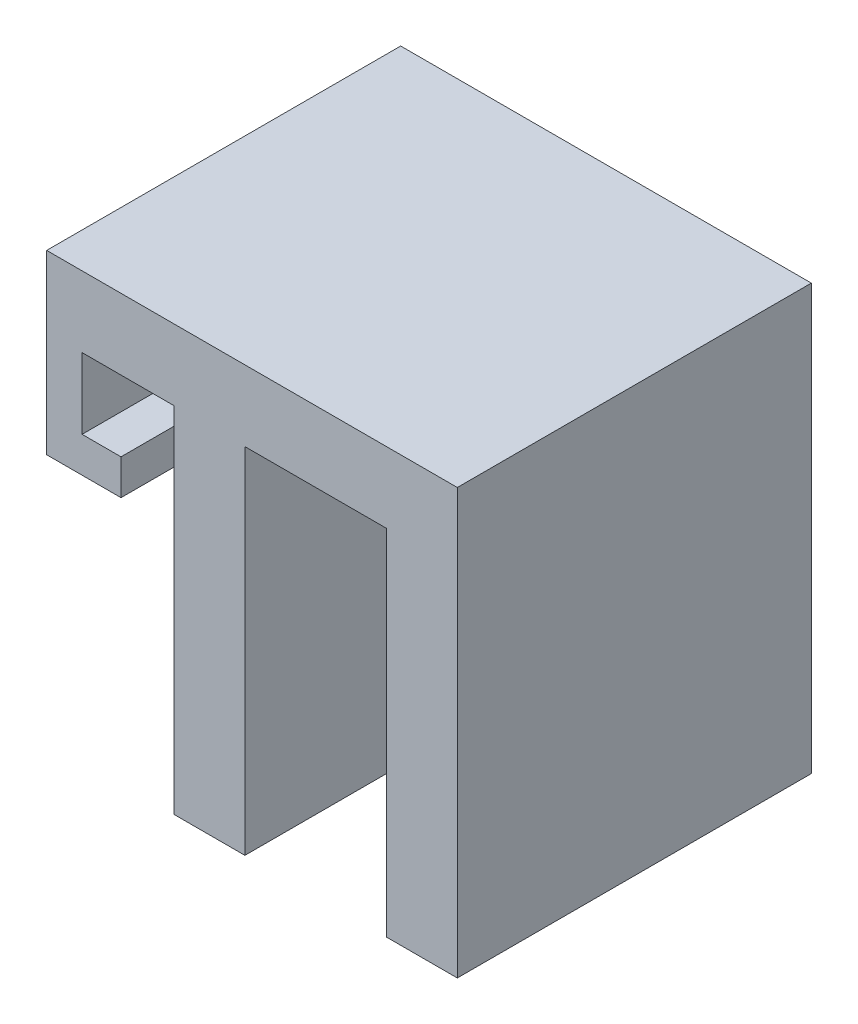
ISO-10303-21;
HEADER;
FILE_DESCRIPTION(('STEP AP214'),'2;1');
FILE_NAME('part.step','',(''),(''),'','','');
FILE_SCHEMA(('AUTOMOTIVE_DESIGN { 1 0 10303 214 1 1 1 1 }'));
ENDSEC;
DATA;
#1=APPLICATION_CONTEXT('core data for automotive mechanical design processes');
#2=APPLICATION_PROTOCOL_DEFINITION('international standard','automotive_design',2000,#1);
#3=PRODUCT_CONTEXT('',#1,'mechanical');
#4=PRODUCT('Part','Part','',(#3));
#5=PRODUCT_RELATED_PRODUCT_CATEGORY('part','',(#4));
#6=PRODUCT_DEFINITION_FORMATION('','',#4);
#7=PRODUCT_DEFINITION_CONTEXT('part definition',#1,'design');
#8=PRODUCT_DEFINITION('design','',#6,#7);
#9=PRODUCT_DEFINITION_SHAPE('','',#8);
#10=(LENGTH_UNIT() NAMED_UNIT(*) SI_UNIT(.MILLI.,.METRE.));
#11=(NAMED_UNIT(*) PLANE_ANGLE_UNIT() SI_UNIT($,.RADIAN.));
#12=(NAMED_UNIT(*) SI_UNIT($,.STERADIAN.) SOLID_ANGLE_UNIT());
#13=UNCERTAINTY_MEASURE_WITH_UNIT(LENGTH_MEASURE(1.E-05),#10,'distance_accuracy_value','');
#14=(GEOMETRIC_REPRESENTATION_CONTEXT(3) GLOBAL_UNCERTAINTY_ASSIGNED_CONTEXT((#13)) GLOBAL_UNIT_ASSIGNED_CONTEXT((#10,
#11,#12)) REPRESENTATION_CONTEXT('',''));
#15=CARTESIAN_POINT('',(0.,0.,0.));
#16=DIRECTION('',(0.,0.,1.));
#17=DIRECTION('',(1.,0.,0.));
#18=AXIS2_PLACEMENT_3D('',#15,#16,#17);
#19=CARTESIAN_POINT('',(0.,0.,10.));
#20=DIRECTION('',(1.,0.,0.));
#21=DIRECTION('',(0.,1.,0.));
#22=AXIS2_PLACEMENT_3D('',#19,#20,#21);
#23=PLANE('',#22);
#24=DIRECTION('',(0.,-1.,0.));
#25=VECTOR('',#24,1.);
#26=CARTESIAN_POINT('',(0.,0.,0.));
#27=LINE('',#26,#25);
#28=CARTESIAN_POINT('',(0.,0.,0.));
#29=VERTEX_POINT('',#28);
#30=CARTESIAN_POINT('',(0.,-10.,0.));
#31=VERTEX_POINT('',#30);
#32=EDGE_CURVE('E165',#29,#31,#27,.T.);
#33=ORIENTED_EDGE('',*,*,#32,.T.);
#34=DIRECTION('',(0.,0.,-1.));
#35=VECTOR('',#34,1.);
#36=CARTESIAN_POINT('',(0.,-10.,10.));
#37=LINE('',#36,#35);
#38=CARTESIAN_POINT('',(0.,-10.,10.));
#39=VERTEX_POINT('',#38);
#40=EDGE_CURVE('E11',#39,#31,#37,.T.);
#41=ORIENTED_EDGE('',*,*,#40,.F.);
#42=DIRECTION('',(0.,-1.,0.));
#43=VECTOR('',#42,1.);
#44=CARTESIAN_POINT('',(0.,0.,10.));
#45=LINE('',#44,#43);
#46=CARTESIAN_POINT('',(0.,0.,10.));
#47=VERTEX_POINT('',#46);
#48=EDGE_CURVE('E193',#47,#39,#45,.T.);
#49=ORIENTED_EDGE('',*,*,#48,.F.);
#50=DIRECTION('',(0.,0.,-1.));
#51=VECTOR('',#50,1.);
#52=CARTESIAN_POINT('',(0.,0.,10.));
#53=LINE('',#52,#51);
#54=EDGE_CURVE('E161',#47,#29,#53,.T.);
#55=ORIENTED_EDGE('',*,*,#54,.T.);
#56=EDGE_LOOP('',(#33,#41,#49,#55));
#57=FACE_BOUND('',#56,.T.);
#58=ADVANCED_FACE('F33',(#57),#23,.F.);
#59=CARTESIAN_POINT('',(0.,-10.,10.));
#60=DIRECTION('',(0.,1.,0.));
#61=DIRECTION('',(0.,0.,1.));
#62=AXIS2_PLACEMENT_3D('',#59,#60,#61);
#63=PLANE('',#62);
#64=DIRECTION('',(1.,0.,0.));
#65=VECTOR('',#64,1.);
#66=CARTESIAN_POINT('',(0.,-10.,0.));
#67=LINE('',#66,#65);
#68=CARTESIAN_POINT('',(2.,-10.,0.));
#69=VERTEX_POINT('',#68);
#70=EDGE_CURVE('E168',#31,#69,#67,.T.);
#71=ORIENTED_EDGE('',*,*,#70,.T.);
#72=DIRECTION('',(0.,0.,-1.));
#73=VECTOR('',#72,1.);
#74=CARTESIAN_POINT('',(2.,-10.,10.));
#75=LINE('',#74,#73);
#76=CARTESIAN_POINT('',(2.,-10.,10.));
#77=VERTEX_POINT('',#76);
#78=EDGE_CURVE('E41',#77,#69,#75,.T.);
#79=ORIENTED_EDGE('',*,*,#78,.F.);
#80=DIRECTION('',(1.,0.,0.));
#81=VECTOR('',#80,1.);
#82=CARTESIAN_POINT('',(0.,-10.,10.));
#83=LINE('',#82,#81);
#84=EDGE_CURVE('E110',#39,#77,#83,.T.);
#85=ORIENTED_EDGE('',*,*,#84,.F.);
#86=ORIENTED_EDGE('',*,*,#40,.T.);
#87=EDGE_LOOP('',(#71,#79,#85,#86));
#88=FACE_BOUND('',#87,.T.);
#89=ADVANCED_FACE('F279',(#88),#63,.F.);
#90=CARTESIAN_POINT('',(2.,-10.,10.));
#91=DIRECTION('',(-1.,0.,0.));
#92=DIRECTION('',(0.,0.,1.));
#93=AXIS2_PLACEMENT_3D('',#90,#91,#92);
#94=PLANE('',#93);
#95=DIRECTION('',(0.,1.,0.));
#96=VECTOR('',#95,1.);
#97=CARTESIAN_POINT('',(2.,-10.,0.));
#98=LINE('',#97,#96);
#99=CARTESIAN_POINT('',(2.,2.,0.));
#100=VERTEX_POINT('',#99);
#101=EDGE_CURVE('E170',#69,#100,#98,.T.);
#102=ORIENTED_EDGE('',*,*,#101,.T.);
#103=DIRECTION('',(0.,0.,-1.));
#104=VECTOR('',#103,1.);
#105=CARTESIAN_POINT('',(2.,2.,10.));
#106=LINE('',#105,#104);
#107=CARTESIAN_POINT('',(2.,2.,10.));
#108=VERTEX_POINT('',#107);
#109=EDGE_CURVE('E218',#108,#100,#106,.T.);
#110=ORIENTED_EDGE('',*,*,#109,.F.);
#111=DIRECTION('',(0.,1.,0.));
#112=VECTOR('',#111,1.);
#113=CARTESIAN_POINT('',(2.,-10.,10.));
#114=LINE('',#113,#112);
#115=EDGE_CURVE('E226',#77,#108,#114,.T.);
#116=ORIENTED_EDGE('',*,*,#115,.F.);
#117=ORIENTED_EDGE('',*,*,#78,.T.);
#118=EDGE_LOOP('',(#102,#110,#116,#117));
#119=FACE_BOUND('',#118,.T.);
#120=ADVANCED_FACE('F224',(#119),#94,.F.);
#121=CARTESIAN_POINT('',(-8.,2.,10.));
#122=DIRECTION('',(0.,-1.,0.));
#123=DIRECTION('',(0.,0.,-1.));
#124=AXIS2_PLACEMENT_3D('',#121,#122,#123);
#125=PLANE('',#124);
#126=DIRECTION('',(-1.,0.,0.));
#127=VECTOR('',#126,1.);
#128=CARTESIAN_POINT('',(-8.,2.,0.));
#129=LINE('',#128,#127);
#130=CARTESIAN_POINT('',(-9.6,2.,0.));
#131=VERTEX_POINT('',#130);
#132=EDGE_CURVE('E173',#100,#131,#129,.T.);
#133=ORIENTED_EDGE('',*,*,#132,.T.);
#134=DIRECTION('',(0.,0.,-1.));
#135=VECTOR('',#134,1.);
#136=CARTESIAN_POINT('',(-9.6,2.,10.));
#137=LINE('',#136,#135);
#138=CARTESIAN_POINT('',(-9.6,2.,10.));
#139=VERTEX_POINT('',#138);
#140=EDGE_CURVE('E215',#139,#131,#137,.T.);
#141=ORIENTED_EDGE('',*,*,#140,.F.);
#142=DIRECTION('',(-1.,0.,0.));
#143=VECTOR('',#142,1.);
#144=CARTESIAN_POINT('',(2.,2.,10.));
#145=LINE('',#144,#143);
#146=EDGE_CURVE('E243',#108,#139,#145,.T.);
#147=ORIENTED_EDGE('',*,*,#146,.F.);
#148=ORIENTED_EDGE('',*,*,#109,.T.);
#149=EDGE_LOOP('',(#133,#141,#147,#148));
#150=FACE_BOUND('',#149,.T.);
#151=ADVANCED_FACE('F234',(#150),#125,.F.);
#152=CARTESIAN_POINT('',(-9.6,2.,10.));
#153=DIRECTION('',(1.,0.,0.));
#154=DIRECTION('',(0.,0.,-1.));
#155=AXIS2_PLACEMENT_3D('',#152,#153,#154);
#156=PLANE('',#155);
#157=DIRECTION('',(0.,-1.,0.));
#158=VECTOR('',#157,1.);
#159=CARTESIAN_POINT('',(-9.6,2.,0.));
#160=LINE('',#159,#158);
#161=CARTESIAN_POINT('',(-9.6,-3.,0.));
#162=VERTEX_POINT('',#161);
#163=EDGE_CURVE('E175',#131,#162,#160,.T.);
#164=ORIENTED_EDGE('',*,*,#163,.T.);
#165=DIRECTION('',(0.,0.,-1.));
#166=VECTOR('',#165,1.);
#167=CARTESIAN_POINT('',(-9.6,-3.,10.));
#168=LINE('',#167,#166);
#169=CARTESIAN_POINT('',(-9.6,-3.,10.));
#170=VERTEX_POINT('',#169);
#171=EDGE_CURVE('E212',#170,#162,#168,.T.);
#172=ORIENTED_EDGE('',*,*,#171,.F.);
#173=DIRECTION('',(0.,-1.,0.));
#174=VECTOR('',#173,1.);
#175=CARTESIAN_POINT('',(-9.6,2.,10.));
#176=LINE('',#175,#174);
#177=EDGE_CURVE('E240',#139,#170,#176,.T.);
#178=ORIENTED_EDGE('',*,*,#177,.F.);
#179=ORIENTED_EDGE('',*,*,#140,.T.);
#180=EDGE_LOOP('',(#164,#172,#178,#179));
#181=FACE_BOUND('',#180,.T.);
#182=ADVANCED_FACE('F238',(#181),#156,.F.);
#183=CARTESIAN_POINT('',(-9.6,-3.,10.));
#184=DIRECTION('',(0.,1.,0.));
#185=DIRECTION('',(0.,0.,1.));
#186=AXIS2_PLACEMENT_3D('',#183,#184,#185);
#187=PLANE('',#186);
#188=DIRECTION('',(1.,0.,0.));
#189=VECTOR('',#188,1.);
#190=CARTESIAN_POINT('',(-9.6,-3.,0.));
#191=LINE('',#190,#189);
#192=CARTESIAN_POINT('',(-7.5,-3.,0.));
#193=VERTEX_POINT('',#192);
#194=EDGE_CURVE('E177',#162,#193,#191,.T.);
#195=ORIENTED_EDGE('',*,*,#194,.T.);
#196=DIRECTION('',(0.,0.,-1.));
#197=VECTOR('',#196,1.);
#198=CARTESIAN_POINT('',(-7.5,-3.,10.));
#199=LINE('',#198,#197);
#200=CARTESIAN_POINT('',(-7.5,-3.,10.));
#201=VERTEX_POINT('',#200);
#202=EDGE_CURVE('E209',#201,#193,#199,.T.);
#203=ORIENTED_EDGE('',*,*,#202,.F.);
#204=DIRECTION('',(1.,0.,0.));
#205=VECTOR('',#204,1.);
#206=CARTESIAN_POINT('',(-9.6,-3.,10.));
#207=LINE('',#206,#205);
#208=EDGE_CURVE('E242',#170,#201,#207,.T.);
#209=ORIENTED_EDGE('',*,*,#208,.F.);
#210=ORIENTED_EDGE('',*,*,#171,.T.);
#211=EDGE_LOOP('',(#195,#203,#209,#210));
#212=FACE_BOUND('',#211,.T.);
#213=ADVANCED_FACE('F292',(#212),#187,.F.);
#214=CARTESIAN_POINT('',(-7.5,-3.,10.));
#215=DIRECTION('',(-1.,0.,0.));
#216=DIRECTION('',(0.,0.,1.));
#217=AXIS2_PLACEMENT_3D('',#214,#215,#216);
#218=PLANE('',#217);
#219=DIRECTION('',(0.,1.,0.));
#220=VECTOR('',#219,1.);
#221=CARTESIAN_POINT('',(-7.5,-3.,0.));
#222=LINE('',#221,#220);
#223=CARTESIAN_POINT('',(-7.5,-2.,0.));
#224=VERTEX_POINT('',#223);
#225=EDGE_CURVE('E179',#193,#224,#222,.T.);
#226=ORIENTED_EDGE('',*,*,#225,.T.);
#227=DIRECTION('',(0.,0.,-1.));
#228=VECTOR('',#227,1.);
#229=CARTESIAN_POINT('',(-7.5,-2.,10.));
#230=LINE('',#229,#228);
#231=CARTESIAN_POINT('',(-7.5,-2.,10.));
#232=VERTEX_POINT('',#231);
#233=EDGE_CURVE('E206',#232,#224,#230,.T.);
#234=ORIENTED_EDGE('',*,*,#233,.F.);
#235=DIRECTION('',(0.,1.,0.));
#236=VECTOR('',#235,1.);
#237=CARTESIAN_POINT('',(-7.5,-3.,10.));
#238=LINE('',#237,#236);
#239=EDGE_CURVE('E245',#201,#232,#238,.T.);
#240=ORIENTED_EDGE('',*,*,#239,.F.);
#241=ORIENTED_EDGE('',*,*,#202,.T.);
#242=EDGE_LOOP('',(#226,#234,#240,#241));
#243=FACE_BOUND('',#242,.T.);
#244=ADVANCED_FACE('F295',(#243),#218,.F.);
#245=CARTESIAN_POINT('',(-7.5,-2.,10.));
#246=DIRECTION('',(0.,-1.,0.));
#247=DIRECTION('',(1.,0.,0.));
#248=AXIS2_PLACEMENT_3D('',#245,#246,#247);
#249=PLANE('',#248);
#250=DIRECTION('',(-1.,0.,0.));
#251=VECTOR('',#250,1.);
#252=CARTESIAN_POINT('',(-7.5,-2.,0.));
#253=LINE('',#252,#251);
#254=CARTESIAN_POINT('',(-8.6,-2.,0.));
#255=VERTEX_POINT('',#254);
#256=EDGE_CURVE('E181',#224,#255,#253,.T.);
#257=ORIENTED_EDGE('',*,*,#256,.T.);
#258=DIRECTION('',(0.,0.,-1.));
#259=VECTOR('',#258,1.);
#260=CARTESIAN_POINT('',(-8.6,-2.,10.));
#261=LINE('',#260,#259);
#262=CARTESIAN_POINT('',(-8.6,-2.,10.));
#263=VERTEX_POINT('',#262);
#264=EDGE_CURVE('E203',#263,#255,#261,.T.);
#265=ORIENTED_EDGE('',*,*,#264,.F.);
#266=DIRECTION('',(-1.,0.,0.));
#267=VECTOR('',#266,1.);
#268=CARTESIAN_POINT('',(-7.5,-2.,10.));
#269=LINE('',#268,#267);
#270=EDGE_CURVE('E251',#232,#263,#269,.T.);
#271=ORIENTED_EDGE('',*,*,#270,.F.);
#272=ORIENTED_EDGE('',*,*,#233,.T.);
#273=EDGE_LOOP('',(#257,#265,#271,#272));
#274=FACE_BOUND('',#273,.T.);
#275=ADVANCED_FACE('F299',(#274),#249,.F.);
#276=CARTESIAN_POINT('',(-8.6,-2.,10.));
#277=DIRECTION('',(-1.,0.,0.));
#278=DIRECTION('',(0.,0.,1.));
#279=AXIS2_PLACEMENT_3D('',#276,#277,#278);
#280=PLANE('',#279);
#281=DIRECTION('',(0.,1.,0.));
#282=VECTOR('',#281,1.);
#283=CARTESIAN_POINT('',(-8.6,-2.,0.));
#284=LINE('',#283,#282);
#285=CARTESIAN_POINT('',(-8.6,0.,0.));
#286=VERTEX_POINT('',#285);
#287=EDGE_CURVE('E183',#255,#286,#284,.T.);
#288=ORIENTED_EDGE('',*,*,#287,.T.);
#289=DIRECTION('',(0.,0.,-1.));
#290=VECTOR('',#289,1.);
#291=CARTESIAN_POINT('',(-8.6,0.,10.));
#292=LINE('',#291,#290);
#293=CARTESIAN_POINT('',(-8.6,0.,10.));
#294=VERTEX_POINT('',#293);
#295=EDGE_CURVE('E200',#294,#286,#292,.T.);
#296=ORIENTED_EDGE('',*,*,#295,.F.);
#297=DIRECTION('',(0.,1.,0.));
#298=VECTOR('',#297,1.);
#299=CARTESIAN_POINT('',(-8.6,-2.,10.));
#300=LINE('',#299,#298);
#301=EDGE_CURVE('E253',#263,#294,#300,.T.);
#302=ORIENTED_EDGE('',*,*,#301,.F.);
#303=ORIENTED_EDGE('',*,*,#264,.T.);
#304=EDGE_LOOP('',(#288,#296,#302,#303));
#305=FACE_BOUND('',#304,.T.);
#306=ADVANCED_FACE('F303',(#305),#280,.F.);
#307=CARTESIAN_POINT('',(-6.,0.,10.));
#308=DIRECTION('',(0.,1.,0.));
#309=DIRECTION('',(-1.,0.,0.));
#310=AXIS2_PLACEMENT_3D('',#307,#308,#309);
#311=PLANE('',#310);
#312=DIRECTION('',(1.,0.,0.));
#313=VECTOR('',#312,1.);
#314=CARTESIAN_POINT('',(-6.,0.,0.));
#315=LINE('',#314,#313);
#316=CARTESIAN_POINT('',(-6.,0.,0.));
#317=VERTEX_POINT('',#316);
#318=EDGE_CURVE('E186',#286,#317,#315,.T.);
#319=ORIENTED_EDGE('',*,*,#318,.T.);
#320=DIRECTION('',(0.,0.,-1.));
#321=VECTOR('',#320,1.);
#322=CARTESIAN_POINT('',(-6.,0.,10.));
#323=LINE('',#322,#321);
#324=CARTESIAN_POINT('',(-6.,0.,10.));
#325=VERTEX_POINT('',#324);
#326=EDGE_CURVE('E197',#325,#317,#323,.T.);
#327=ORIENTED_EDGE('',*,*,#326,.F.);
#328=DIRECTION('',(1.,0.,0.));
#329=VECTOR('',#328,1.);
#330=CARTESIAN_POINT('',(-8.6,0.,10.));
#331=LINE('',#330,#329);
#332=EDGE_CURVE('E255',#294,#325,#331,.T.);
#333=ORIENTED_EDGE('',*,*,#332,.F.);
#334=ORIENTED_EDGE('',*,*,#295,.T.);
#335=EDGE_LOOP('',(#319,#327,#333,#334));
#336=FACE_BOUND('',#335,.T.);
#337=ADVANCED_FACE('F261',(#336),#311,.F.);
#338=CARTESIAN_POINT('',(-6.,0.,10.));
#339=DIRECTION('',(1.,0.,0.));
#340=DIRECTION('',(0.,1.,0.));
#341=AXIS2_PLACEMENT_3D('',#338,#339,#340);
#342=PLANE('',#341);
#343=DIRECTION('',(0.,-1.,0.));
#344=VECTOR('',#343,1.);
#345=CARTESIAN_POINT('',(-6.,0.,0.));
#346=LINE('',#345,#344);
#347=CARTESIAN_POINT('',(-6.,-10.,0.));
#348=VERTEX_POINT('',#347);
#349=EDGE_CURVE('E188',#317,#348,#346,.T.);
#350=ORIENTED_EDGE('',*,*,#349,.T.);
#351=DIRECTION('',(0.,0.,-1.));
#352=VECTOR('',#351,1.);
#353=CARTESIAN_POINT('',(-6.,-10.,10.));
#354=LINE('',#353,#352);
#355=CARTESIAN_POINT('',(-6.,-10.,10.));
#356=VERTEX_POINT('',#355);
#357=EDGE_CURVE('E156',#356,#348,#354,.T.);
#358=ORIENTED_EDGE('',*,*,#357,.F.);
#359=DIRECTION('',(0.,-1.,0.));
#360=VECTOR('',#359,1.);
#361=CARTESIAN_POINT('',(-6.,0.,10.));
#362=LINE('',#361,#360);
#363=EDGE_CURVE('E147',#325,#356,#362,.T.);
#364=ORIENTED_EDGE('',*,*,#363,.F.);
#365=ORIENTED_EDGE('',*,*,#326,.T.);
#366=EDGE_LOOP('',(#350,#358,#364,#365));
#367=FACE_BOUND('',#366,.T.);
#368=ADVANCED_FACE('F264',(#367),#342,.F.);
#369=CARTESIAN_POINT('',(-6.,-10.,10.));
#370=DIRECTION('',(0.,1.,0.));
#371=DIRECTION('',(0.,0.,1.));
#372=AXIS2_PLACEMENT_3D('',#369,#370,#371);
#373=PLANE('',#372);
#374=DIRECTION('',(1.,0.,0.));
#375=VECTOR('',#374,1.);
#376=CARTESIAN_POINT('',(-6.,-10.,0.));
#377=LINE('',#376,#375);
#378=CARTESIAN_POINT('',(-4.,-10.,0.));
#379=VERTEX_POINT('',#378);
#380=EDGE_CURVE('E155',#348,#379,#377,.T.);
#381=ORIENTED_EDGE('',*,*,#380,.T.);
#382=DIRECTION('',(0.,0.,-1.));
#383=VECTOR('',#382,1.);
#384=CARTESIAN_POINT('',(-4.,-10.,10.));
#385=LINE('',#384,#383);
#386=CARTESIAN_POINT('',(-4.,-10.,10.));
#387=VERTEX_POINT('',#386);
#388=EDGE_CURVE('E152',#387,#379,#385,.T.);
#389=ORIENTED_EDGE('',*,*,#388,.F.);
#390=DIRECTION('',(1.,0.,0.));
#391=VECTOR('',#390,1.);
#392=CARTESIAN_POINT('',(-6.,-10.,10.));
#393=LINE('',#392,#391);
#394=EDGE_CURVE('E141',#356,#387,#393,.T.);
#395=ORIENTED_EDGE('',*,*,#394,.F.);
#396=ORIENTED_EDGE('',*,*,#357,.T.);
#397=EDGE_LOOP('',(#381,#389,#395,#396));
#398=FACE_BOUND('',#397,.T.);
#399=ADVANCED_FACE('F153',(#398),#373,.F.);
#400=CARTESIAN_POINT('',(-4.,-10.,10.));
#401=DIRECTION('',(-1.,0.,0.));
#402=DIRECTION('',(0.,-1.,0.));
#403=AXIS2_PLACEMENT_3D('',#400,#401,#402);
#404=PLANE('',#403);
#405=DIRECTION('',(0.,1.,0.));
#406=VECTOR('',#405,1.);
#407=CARTESIAN_POINT('',(-4.,-10.,0.));
#408=LINE('',#407,#406);
#409=CARTESIAN_POINT('',(-4.,0.,0.));
#410=VERTEX_POINT('',#409);
#411=EDGE_CURVE('E96',#379,#410,#408,.T.);
#412=ORIENTED_EDGE('',*,*,#411,.T.);
#413=DIRECTION('',(0.,0.,-1.));
#414=VECTOR('',#413,1.);
#415=CARTESIAN_POINT('',(-4.,0.,10.));
#416=LINE('',#415,#414);
#417=CARTESIAN_POINT('',(-4.,0.,10.));
#418=VERTEX_POINT('',#417);
#419=EDGE_CURVE('E157',#418,#410,#416,.T.);
#420=ORIENTED_EDGE('',*,*,#419,.F.);
#421=DIRECTION('',(0.,1.,0.));
#422=VECTOR('',#421,1.);
#423=CARTESIAN_POINT('',(-4.,-10.,10.));
#424=LINE('',#423,#422);
#425=EDGE_CURVE('E145',#387,#418,#424,.T.);
#426=ORIENTED_EDGE('',*,*,#425,.F.);
#427=ORIENTED_EDGE('',*,*,#388,.T.);
#428=EDGE_LOOP('',(#412,#420,#426,#427));
#429=FACE_BOUND('',#428,.T.);
#430=ADVANCED_FACE('F159',(#429),#404,.F.);
#431=CARTESIAN_POINT('',(-4.,0.,10.));
#432=DIRECTION('',(0.,1.,0.));
#433=DIRECTION('',(0.,0.,1.));
#434=AXIS2_PLACEMENT_3D('',#431,#432,#433);
#435=PLANE('',#434);
#436=DIRECTION('',(1.,0.,0.));
#437=VECTOR('',#436,1.);
#438=CARTESIAN_POINT('',(-4.,0.,0.));
#439=LINE('',#438,#437);
#440=EDGE_CURVE('E102',#410,#29,#439,.T.);
#441=ORIENTED_EDGE('',*,*,#440,.T.);
#442=ORIENTED_EDGE('',*,*,#54,.F.);
#443=DIRECTION('',(1.,0.,0.));
#444=VECTOR('',#443,1.);
#445=CARTESIAN_POINT('',(-4.,0.,10.));
#446=LINE('',#445,#444);
#447=EDGE_CURVE('E49',#418,#47,#446,.T.);
#448=ORIENTED_EDGE('',*,*,#447,.F.);
#449=ORIENTED_EDGE('',*,*,#419,.T.);
#450=EDGE_LOOP('',(#441,#442,#448,#449));
#451=FACE_BOUND('',#450,.T.);
#452=ADVANCED_FACE('F268',(#451),#435,.F.);
#453=CARTESIAN_POINT('',(0.,0.,10.));
#454=DIRECTION('',(0.,0.,1.));
#455=DIRECTION('',(1.,0.,0.));
#456=AXIS2_PLACEMENT_3D('',#453,#454,#455);
#457=PLANE('',#456);
#458=ORIENTED_EDGE('',*,*,#48,.T.);
#459=ORIENTED_EDGE('',*,*,#84,.T.);
#460=ORIENTED_EDGE('',*,*,#115,.T.);
#461=ORIENTED_EDGE('',*,*,#146,.T.);
#462=ORIENTED_EDGE('',*,*,#177,.T.);
#463=ORIENTED_EDGE('',*,*,#208,.T.);
#464=ORIENTED_EDGE('',*,*,#239,.T.);
#465=ORIENTED_EDGE('',*,*,#270,.T.);
#466=ORIENTED_EDGE('',*,*,#301,.T.);
#467=ORIENTED_EDGE('',*,*,#332,.T.);
#468=ORIENTED_EDGE('',*,*,#363,.T.);
#469=ORIENTED_EDGE('',*,*,#394,.T.);
#470=ORIENTED_EDGE('',*,*,#425,.T.);
#471=ORIENTED_EDGE('',*,*,#447,.T.);
#472=EDGE_LOOP('',(#458,#459,#460,#461,#462,#463,#464,#465,#466,#467,#468,#469,#470,#471));
#473=FACE_BOUND('',#472,.T.);
#474=ADVANCED_FACE('F143',(#473),#457,.T.);
#475=CARTESIAN_POINT('',(0.,0.,0.));
#476=DIRECTION('',(0.,0.,1.));
#477=DIRECTION('',(1.,0.,0.));
#478=AXIS2_PLACEMENT_3D('',#475,#476,#477);
#479=PLANE('',#478);
#480=ORIENTED_EDGE('',*,*,#32,.F.);
#481=ORIENTED_EDGE('',*,*,#440,.F.);
#482=ORIENTED_EDGE('',*,*,#411,.F.);
#483=ORIENTED_EDGE('',*,*,#380,.F.);
#484=ORIENTED_EDGE('',*,*,#349,.F.);
#485=ORIENTED_EDGE('',*,*,#318,.F.);
#486=ORIENTED_EDGE('',*,*,#287,.F.);
#487=ORIENTED_EDGE('',*,*,#256,.F.);
#488=ORIENTED_EDGE('',*,*,#225,.F.);
#489=ORIENTED_EDGE('',*,*,#194,.F.);
#490=ORIENTED_EDGE('',*,*,#163,.F.);
#491=ORIENTED_EDGE('',*,*,#132,.F.);
#492=ORIENTED_EDGE('',*,*,#101,.F.);
#493=ORIENTED_EDGE('',*,*,#70,.F.);
#494=EDGE_LOOP('',(#480,#481,#482,#483,#484,#485,#486,#487,#488,#489,#490,#491,#492,#493));
#495=FACE_BOUND('',#494,.T.);
#496=ADVANCED_FACE('F229',(#495),#479,.F.);
#497=CLOSED_SHELL('',(#58,#89,#120,#151,#182,#213,#244,#275,#306,#337,#368,#399,#430,#452,#474,#496));
#498=MANIFOLD_SOLID_BREP('B2',#497);
#499=ADVANCED_BREP_SHAPE_REPRESENTATION('',(#18,#498),#14);
#500=SHAPE_DEFINITION_REPRESENTATION(#9,#499);
ENDSEC;
END-ISO-10303-21;
